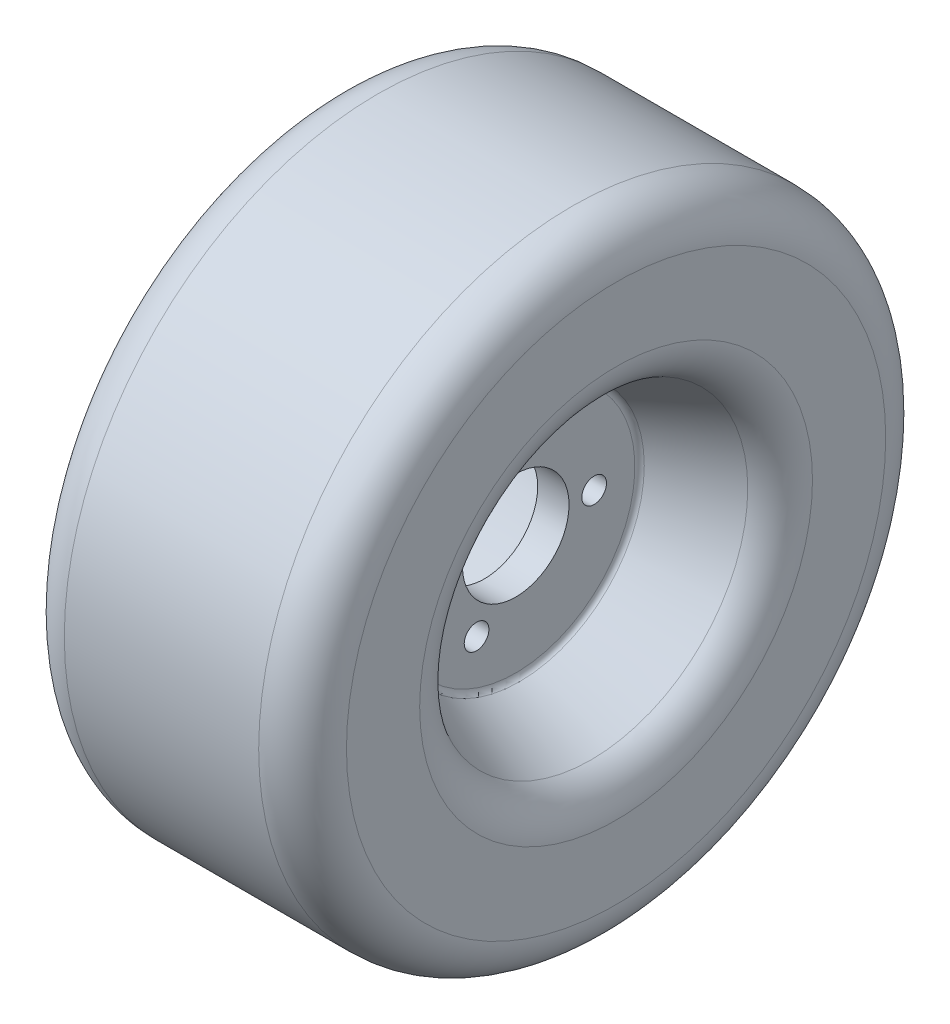
ISO-10303-21;
HEADER;
FILE_DESCRIPTION(('STEP AP214'),'2;1');
FILE_NAME('part.step','',(''),(''),'','','');
FILE_SCHEMA(('AUTOMOTIVE_DESIGN { 1 0 10303 214 1 1 1 1 }'));
ENDSEC;
DATA;
#1=APPLICATION_CONTEXT('core data for automotive mechanical design processes');
#2=APPLICATION_PROTOCOL_DEFINITION('international standard','automotive_design',2000,#1);
#3=PRODUCT_CONTEXT('',#1,'mechanical');
#4=PRODUCT('Part','Part','',(#3));
#5=PRODUCT_RELATED_PRODUCT_CATEGORY('part','',(#4));
#6=PRODUCT_DEFINITION_FORMATION('','',#4);
#7=PRODUCT_DEFINITION_CONTEXT('part definition',#1,'design');
#8=PRODUCT_DEFINITION('design','',#6,#7);
#9=PRODUCT_DEFINITION_SHAPE('','',#8);
#10=(LENGTH_UNIT() NAMED_UNIT(*) SI_UNIT(.MILLI.,.METRE.));
#11=(NAMED_UNIT(*) PLANE_ANGLE_UNIT() SI_UNIT($,.RADIAN.));
#12=(NAMED_UNIT(*) SI_UNIT($,.STERADIAN.) SOLID_ANGLE_UNIT());
#13=UNCERTAINTY_MEASURE_WITH_UNIT(LENGTH_MEASURE(1.E-05),#10,'distance_accuracy_value','');
#14=(GEOMETRIC_REPRESENTATION_CONTEXT(3) GLOBAL_UNCERTAINTY_ASSIGNED_CONTEXT((#13)) GLOBAL_UNIT_ASSIGNED_CONTEXT((#10,
#11,#12)) REPRESENTATION_CONTEXT('',''));
#15=CARTESIAN_POINT('',(0.,0.,0.));
#16=DIRECTION('',(0.,0.,1.));
#17=DIRECTION('',(1.,0.,0.));
#18=AXIS2_PLACEMENT_3D('',#15,#16,#17);
#19=CARTESIAN_POINT('',(16.51,0.,0.));
#20=DIRECTION('',(-1.,0.,0.));
#21=DIRECTION('',(0.,0.,1.));
#22=AXIS2_PLACEMENT_3D('',#19,#20,#21);
#23=PLANE('',#22);
#24=CARTESIAN_POINT('',(16.51,0.,0.));
#25=DIRECTION('',(-1.,0.,0.));
#26=DIRECTION('',(0.,0.,1.));
#27=AXIS2_PLACEMENT_3D('',#24,#25,#26);
#28=CIRCLE('',#27,48.2441001243799);
#29=CARTESIAN_POINT('',(16.51,0.,48.2441001243799));
#30=VERTEX_POINT('',#29);
#31=EDGE_CURVE('E43',#30,#30,#28,.F.);
#32=ORIENTED_EDGE('',*,*,#31,.T.);
#33=EDGE_LOOP('',(#32));
#34=FACE_BOUND('',#33,.T.);
#35=CARTESIAN_POINT('',(16.51,0.,-31.75));
#36=DIRECTION('',(-1.,0.,0.));
#37=DIRECTION('',(0.,0.,1.));
#38=AXIS2_PLACEMENT_3D('',#35,#36,#37);
#39=CIRCLE('',#38,5.);
#40=CARTESIAN_POINT('',(16.51,0.,-26.75));
#41=VERTEX_POINT('',#40);
#42=EDGE_CURVE('E56',#41,#41,#39,.T.);
#43=ORIENTED_EDGE('',*,*,#42,.T.);
#44=EDGE_LOOP('',(#43));
#45=FACE_BOUND('',#44,.T.);
#46=CARTESIAN_POINT('',(16.51,-27.4963065701559,15.8750000000001));
#47=DIRECTION('',(-1.,0.,0.));
#48=DIRECTION('',(0.,0.,1.));
#49=AXIS2_PLACEMENT_3D('',#46,#47,#48);
#50=CIRCLE('',#49,5.);
#51=CARTESIAN_POINT('',(16.51,-27.4963065701559,20.8750000000001));
#52=VERTEX_POINT('',#51);
#53=EDGE_CURVE('E57',#52,#52,#50,.T.);
#54=ORIENTED_EDGE('',*,*,#53,.T.);
#55=EDGE_LOOP('',(#54));
#56=FACE_BOUND('',#55,.T.);
#57=CARTESIAN_POINT('',(16.51,27.4963065701561,15.8749999999997));
#58=DIRECTION('',(-1.,0.,0.));
#59=DIRECTION('',(0.,0.,1.));
#60=AXIS2_PLACEMENT_3D('',#57,#58,#59);
#61=CIRCLE('',#60,5.);
#62=CARTESIAN_POINT('',(16.51,27.4963065701561,20.8749999999997));
#63=VERTEX_POINT('',#62);
#64=EDGE_CURVE('E61',#63,#63,#61,.T.);
#65=ORIENTED_EDGE('',*,*,#64,.T.);
#66=EDGE_LOOP('',(#65));
#67=FACE_BOUND('',#66,.T.);
#68=CARTESIAN_POINT('',(16.51,0.,0.));
#69=DIRECTION('',(-1.,0.,0.));
#70=DIRECTION('',(0.,0.,1.));
#71=AXIS2_PLACEMENT_3D('',#68,#69,#70);
#72=CIRCLE('',#71,21.59);
#73=CARTESIAN_POINT('',(16.51,0.,21.59));
#74=VERTEX_POINT('',#73);
#75=EDGE_CURVE('E68',#74,#74,#72,.T.);
#76=ORIENTED_EDGE('',*,*,#75,.T.);
#77=EDGE_LOOP('',(#76));
#78=FACE_BOUND('',#77,.T.);
#79=ADVANCED_FACE('F32',(#34,#45,#56,#67,#78),#23,.F.);
#80=CARTESIAN_POINT('',(16.51,0.,0.));
#81=DIRECTION('',(1.,0.,0.));
#82=DIRECTION('',(0.,0.,-1.));
#83=AXIS2_PLACEMENT_3D('',#80,#81,#82);
#84=CONICAL_SURFACE('',#83,49.8917332317404,0.419910702861543);
#85=CARTESIAN_POINT('',(18.0144955553808,0.,0.));
#86=DIRECTION('',(1.,0.,0.));
#87=DIRECTION('',(0.,0.,-1.));
#88=AXIS2_PLACEMENT_3D('',#85,#86,#87);
#89=CIRCLE('',#88,50.563438509604);
#90=CARTESIAN_POINT('',(18.0144955553808,0.,-50.563438509604));
#91=VERTEX_POINT('',#90);
#92=EDGE_CURVE('E47',#91,#91,#89,.F.);
#93=ORIENTED_EDGE('',*,*,#92,.T.);
#94=EDGE_LOOP('',(#93));
#95=FACE_BOUND('',#94,.T.);
#96=CARTESIAN_POINT('',(46.99,0.,0.));
#97=DIRECTION('',(-1.,0.,0.));
#98=DIRECTION('',(0.,0.,1.));
#99=AXIS2_PLACEMENT_3D('',#96,#97,#98);
#100=CIRCLE('',#99,63.5);
#101=CARTESIAN_POINT('',(46.99,0.,63.5));
#102=VERTEX_POINT('',#101);
#103=EDGE_CURVE('E52',#102,#102,#100,.T.);
#104=ORIENTED_EDGE('',*,*,#103,.F.);
#105=EDGE_LOOP('',(#104));
#106=FACE_BOUND('',#105,.T.);
#107=ADVANCED_FACE('F121',(#95,#106),#84,.F.);
#108=CARTESIAN_POINT('',(39.37,0.,0.));
#109=DIRECTION('',(-1.,0.,0.));
#110=DIRECTION('',(0.,0.,1.));
#111=AXIS2_PLACEMENT_3D('',#108,#109,#110);
#112=TOROIDAL_SURFACE('',#111,79.5643705136554,17.78);
#113=CARTESIAN_POINT('',(57.15,0.,0.));
#114=DIRECTION('',(-1.,0.,0.));
#115=DIRECTION('',(0.,0.,1.));
#116=AXIS2_PLACEMENT_3D('',#113,#114,#115);
#117=CIRCLE('',#116,79.5643705136554);
#118=CARTESIAN_POINT('',(57.15,0.,79.5643705136554));
#119=VERTEX_POINT('',#118);
#120=EDGE_CURVE('E71',#119,#119,#117,.T.);
#121=ORIENTED_EDGE('',*,*,#120,.F.);
#122=EDGE_LOOP('',(#121));
#123=FACE_BOUND('',#122,.T.);
#124=ORIENTED_EDGE('',*,*,#103,.T.);
#125=EDGE_LOOP('',(#124));
#126=FACE_BOUND('',#125,.T.);
#127=ADVANCED_FACE('F127',(#123,#126),#112,.T.);
#128=CARTESIAN_POINT('',(57.15,109.22,0.));
#129=DIRECTION('',(-1.,0.,0.));
#130=DIRECTION('',(0.,0.,1.));
#131=AXIS2_PLACEMENT_3D('',#128,#129,#130);
#132=PLANE('',#131);
#133=CARTESIAN_POINT('',(57.15,0.,0.));
#134=DIRECTION('',(-1.,0.,0.));
#135=DIRECTION('',(0.,0.,1.));
#136=AXIS2_PLACEMENT_3D('',#133,#134,#135);
#137=CIRCLE('',#136,109.22);
#138=CARTESIAN_POINT('',(57.15,0.,109.22));
#139=VERTEX_POINT('',#138);
#140=EDGE_CURVE('E74',#139,#139,#137,.T.);
#141=ORIENTED_EDGE('',*,*,#140,.F.);
#142=EDGE_LOOP('',(#141));
#143=FACE_BOUND('',#142,.T.);
#144=ORIENTED_EDGE('',*,*,#120,.T.);
#145=EDGE_LOOP('',(#144));
#146=FACE_BOUND('',#145,.T.);
#147=ADVANCED_FACE('F149',(#143,#146),#132,.F.);
#148=CARTESIAN_POINT('',(39.37,0.,0.));
#149=DIRECTION('',(-1.,0.,0.));
#150=DIRECTION('',(0.,0.,1.));
#151=AXIS2_PLACEMENT_3D('',#148,#149,#150);
#152=TOROIDAL_SURFACE('',#151,109.22,17.78);
#153=CARTESIAN_POINT('',(39.37,0.,0.));
#154=DIRECTION('',(-1.,0.,0.));
#155=DIRECTION('',(0.,0.,1.));
#156=AXIS2_PLACEMENT_3D('',#153,#154,#155);
#157=CIRCLE('',#156,127.);
#158=CARTESIAN_POINT('',(39.37,0.,127.));
#159=VERTEX_POINT('',#158);
#160=EDGE_CURVE('E77',#159,#159,#157,.T.);
#161=ORIENTED_EDGE('',*,*,#160,.F.);
#162=EDGE_LOOP('',(#161));
#163=FACE_BOUND('',#162,.T.);
#164=ORIENTED_EDGE('',*,*,#140,.T.);
#165=EDGE_LOOP('',(#164));
#166=FACE_BOUND('',#165,.T.);
#167=ADVANCED_FACE('F154',(#163,#166),#152,.T.);
#168=CARTESIAN_POINT('',(3.79674298209649,0.,0.));
#169=DIRECTION('',(-1.,0.,0.));
#170=DIRECTION('',(0.,0.,1.));
#171=AXIS2_PLACEMENT_3D('',#168,#169,#170);
#172=CYLINDRICAL_SURFACE('',#171,127.);
#173=CARTESIAN_POINT('',(-39.37,0.,0.));
#174=DIRECTION('',(-1.,0.,0.));
#175=DIRECTION('',(0.,0.,1.));
#176=AXIS2_PLACEMENT_3D('',#173,#174,#175);
#177=CIRCLE('',#176,127.);
#178=CARTESIAN_POINT('',(-39.37,0.,127.));
#179=VERTEX_POINT('',#178);
#180=EDGE_CURVE('E80',#179,#179,#177,.T.);
#181=ORIENTED_EDGE('',*,*,#180,.F.);
#182=EDGE_LOOP('',(#181));
#183=FACE_BOUND('',#182,.T.);
#184=ORIENTED_EDGE('',*,*,#160,.T.);
#185=EDGE_LOOP('',(#184));
#186=FACE_BOUND('',#185,.T.);
#187=ADVANCED_FACE('F161',(#183,#186),#172,.T.);
#188=CARTESIAN_POINT('',(-39.37,0.,0.));
#189=DIRECTION('',(-1.,0.,0.));
#190=DIRECTION('',(0.,0.,1.));
#191=AXIS2_PLACEMENT_3D('',#188,#189,#190);
#192=TOROIDAL_SURFACE('',#191,109.22,17.78);
#193=CARTESIAN_POINT('',(-57.15,0.,0.));
#194=DIRECTION('',(-1.,0.,0.));
#195=DIRECTION('',(0.,0.,1.));
#196=AXIS2_PLACEMENT_3D('',#193,#194,#195);
#197=CIRCLE('',#196,109.22);
#198=CARTESIAN_POINT('',(-57.15,0.,109.22));
#199=VERTEX_POINT('',#198);
#200=EDGE_CURVE('E83',#199,#199,#197,.T.);
#201=ORIENTED_EDGE('',*,*,#200,.F.);
#202=EDGE_LOOP('',(#201));
#203=FACE_BOUND('',#202,.T.);
#204=ORIENTED_EDGE('',*,*,#180,.T.);
#205=EDGE_LOOP('',(#204));
#206=FACE_BOUND('',#205,.T.);
#207=ADVANCED_FACE('F165',(#203,#206),#192,.T.);
#208=CARTESIAN_POINT('',(-57.15,109.22,0.));
#209=DIRECTION('',(1.,0.,0.));
#210=DIRECTION('',(0.,0.,-1.));
#211=AXIS2_PLACEMENT_3D('',#208,#209,#210);
#212=PLANE('',#211);
#213=CARTESIAN_POINT('',(-57.15,0.,0.));
#214=DIRECTION('',(-1.,0.,0.));
#215=DIRECTION('',(0.,0.,1.));
#216=AXIS2_PLACEMENT_3D('',#213,#214,#215);
#217=CIRCLE('',#216,79.5643705136554);
#218=CARTESIAN_POINT('',(-57.15,0.,79.5643705136554));
#219=VERTEX_POINT('',#218);
#220=EDGE_CURVE('E86',#219,#219,#217,.T.);
#221=ORIENTED_EDGE('',*,*,#220,.F.);
#222=EDGE_LOOP('',(#221));
#223=FACE_BOUND('',#222,.T.);
#224=ORIENTED_EDGE('',*,*,#200,.T.);
#225=EDGE_LOOP('',(#224));
#226=FACE_BOUND('',#225,.T.);
#227=ADVANCED_FACE('F169',(#223,#226),#212,.F.);
#228=CARTESIAN_POINT('',(-39.37,0.,0.));
#229=DIRECTION('',(-1.,0.,0.));
#230=DIRECTION('',(0.,0.,1.));
#231=AXIS2_PLACEMENT_3D('',#228,#229,#230);
#232=TOROIDAL_SURFACE('',#231,79.5643705136554,17.78);
#233=CARTESIAN_POINT('',(-46.99,0.,0.));
#234=DIRECTION('',(-1.,0.,0.));
#235=DIRECTION('',(0.,0.,1.));
#236=AXIS2_PLACEMENT_3D('',#233,#234,#235);
#237=CIRCLE('',#236,63.5);
#238=CARTESIAN_POINT('',(-46.99,0.,63.5));
#239=VERTEX_POINT('',#238);
#240=EDGE_CURVE('E89',#239,#239,#237,.T.);
#241=ORIENTED_EDGE('',*,*,#240,.F.);
#242=EDGE_LOOP('',(#241));
#243=FACE_BOUND('',#242,.T.);
#244=ORIENTED_EDGE('',*,*,#220,.T.);
#245=EDGE_LOOP('',(#244));
#246=FACE_BOUND('',#245,.T.);
#247=ADVANCED_FACE('F173',(#243,#246),#232,.T.);
#248=CARTESIAN_POINT('',(-46.99,0.,0.));
#249=DIRECTION('',(-1.,0.,0.));
#250=DIRECTION('',(0.,0.,1.));
#251=AXIS2_PLACEMENT_3D('',#248,#249,#250);
#252=CONICAL_SURFACE('',#251,63.5,0.261799387799146);
#253=CARTESIAN_POINT('',(1.91414335665689,0.,0.));
#254=DIRECTION('',(-1.,0.,0.));
#255=DIRECTION('',(0.,0.,1.));
#256=AXIS2_PLACEMENT_3D('',#253,#254,#255);
#257=CIRCLE('',#256,50.3961742810481);
#258=CARTESIAN_POINT('',(1.91414335665689,0.,50.3961742810481));
#259=VERTEX_POINT('',#258);
#260=EDGE_CURVE('E10',#259,#259,#257,.F.);
#261=ORIENTED_EDGE('',*,*,#260,.T.);
#262=EDGE_LOOP('',(#261));
#263=FACE_BOUND('',#262,.T.);
#264=ORIENTED_EDGE('',*,*,#240,.T.);
#265=EDGE_LOOP('',(#264));
#266=FACE_BOUND('',#265,.T.);
#267=ADVANCED_FACE('F177',(#263,#266),#252,.F.);
#268=CARTESIAN_POINT('',(3.79674298209649,49.8917332317404,0.));
#269=DIRECTION('',(1.,0.,0.));
#270=DIRECTION('',(0.,0.,-1.));
#271=AXIS2_PLACEMENT_3D('',#268,#269,#270);
#272=PLANE('',#271);
#273=CARTESIAN_POINT('',(3.79674298209649,0.,0.));
#274=DIRECTION('',(1.,0.,0.));
#275=DIRECTION('',(0.,0.,-1.));
#276=AXIS2_PLACEMENT_3D('',#273,#274,#275);
#277=CIRCLE('',#276,47.9427226822739);
#278=CARTESIAN_POINT('',(3.79674298209649,0.,-47.9427226822739));
#279=VERTEX_POINT('',#278);
#280=EDGE_CURVE('E39',#279,#279,#277,.F.);
#281=ORIENTED_EDGE('',*,*,#280,.T.);
#282=EDGE_LOOP('',(#281));
#283=FACE_BOUND('',#282,.T.);
#284=CARTESIAN_POINT('',(3.79674298209649,0.,-31.75));
#285=DIRECTION('',(1.,0.,0.));
#286=DIRECTION('',(0.,0.,-1.));
#287=AXIS2_PLACEMENT_3D('',#284,#285,#286);
#288=CIRCLE('',#287,5.);
#289=CARTESIAN_POINT('',(3.79674298209649,0.,-36.75));
#290=VERTEX_POINT('',#289);
#291=EDGE_CURVE('E53',#290,#290,#288,.T.);
#292=ORIENTED_EDGE('',*,*,#291,.T.);
#293=EDGE_LOOP('',(#292));
#294=FACE_BOUND('',#293,.T.);
#295=CARTESIAN_POINT('',(3.79674298209649,-27.4963065701559,15.8750000000001));
#296=DIRECTION('',(1.,0.,0.));
#297=DIRECTION('',(0.,0.,-1.));
#298=AXIS2_PLACEMENT_3D('',#295,#296,#297);
#299=CIRCLE('',#298,5.);
#300=CARTESIAN_POINT('',(3.79674298209649,-27.4963065701559,10.8750000000001));
#301=VERTEX_POINT('',#300);
#302=EDGE_CURVE('E58',#301,#301,#299,.T.);
#303=ORIENTED_EDGE('',*,*,#302,.T.);
#304=EDGE_LOOP('',(#303));
#305=FACE_BOUND('',#304,.T.);
#306=CARTESIAN_POINT('',(3.79674298209649,27.4963065701561,15.8749999999997));
#307=DIRECTION('',(1.,0.,0.));
#308=DIRECTION('',(0.,0.,-1.));
#309=AXIS2_PLACEMENT_3D('',#306,#307,#308);
#310=CIRCLE('',#309,5.);
#311=CARTESIAN_POINT('',(3.79674298209649,27.4963065701561,10.8749999999997));
#312=VERTEX_POINT('',#311);
#313=EDGE_CURVE('E62',#312,#312,#310,.T.);
#314=ORIENTED_EDGE('',*,*,#313,.T.);
#315=EDGE_LOOP('',(#314));
#316=FACE_BOUND('',#315,.T.);
#317=CARTESIAN_POINT('',(3.79674298209649,0.,0.));
#318=DIRECTION('',(1.,0.,0.));
#319=DIRECTION('',(0.,0.,-1.));
#320=AXIS2_PLACEMENT_3D('',#317,#318,#319);
#321=CIRCLE('',#320,21.59);
#322=CARTESIAN_POINT('',(3.79674298209649,0.,-21.59));
#323=VERTEX_POINT('',#322);
#324=EDGE_CURVE('E65',#323,#323,#321,.T.);
#325=ORIENTED_EDGE('',*,*,#324,.T.);
#326=EDGE_LOOP('',(#325));
#327=FACE_BOUND('',#326,.T.);
#328=ADVANCED_FACE('F116',(#283,#294,#305,#316,#327),#272,.F.);
#329=CARTESIAN_POINT('',(-57.15,0.,0.));
#330=DIRECTION('',(1.,0.,0.));
#331=DIRECTION('',(0.,0.,-1.));
#332=AXIS2_PLACEMENT_3D('',#329,#330,#331);
#333=CYLINDRICAL_SURFACE('',#332,21.59);
#334=ORIENTED_EDGE('',*,*,#324,.F.);
#335=EDGE_LOOP('',(#334));
#336=FACE_BOUND('',#335,.T.);
#337=ORIENTED_EDGE('',*,*,#75,.F.);
#338=EDGE_LOOP('',(#337));
#339=FACE_BOUND('',#338,.T.);
#340=ADVANCED_FACE('F106',(#336,#339),#333,.F.);
#341=CARTESIAN_POINT('',(-57.15,27.4963065701561,15.8749999999997));
#342=DIRECTION('',(1.,0.,0.));
#343=DIRECTION('',(0.,0.,-1.));
#344=AXIS2_PLACEMENT_3D('',#341,#342,#343);
#345=CYLINDRICAL_SURFACE('',#344,5.);
#346=ORIENTED_EDGE('',*,*,#313,.F.);
#347=EDGE_LOOP('',(#346));
#348=FACE_BOUND('',#347,.T.);
#349=ORIENTED_EDGE('',*,*,#64,.F.);
#350=EDGE_LOOP('',(#349));
#351=FACE_BOUND('',#350,.T.);
#352=ADVANCED_FACE('F103',(#348,#351),#345,.F.);
#353=CARTESIAN_POINT('',(-57.15,-27.4963065701559,15.8750000000001));
#354=DIRECTION('',(1.,0.,0.));
#355=DIRECTION('',(0.,0.,-1.));
#356=AXIS2_PLACEMENT_3D('',#353,#354,#355);
#357=CYLINDRICAL_SURFACE('',#356,5.);
#358=ORIENTED_EDGE('',*,*,#302,.F.);
#359=EDGE_LOOP('',(#358));
#360=FACE_BOUND('',#359,.T.);
#361=ORIENTED_EDGE('',*,*,#53,.F.);
#362=EDGE_LOOP('',(#361));
#363=FACE_BOUND('',#362,.T.);
#364=ADVANCED_FACE('F105',(#360,#363),#357,.F.);
#365=CARTESIAN_POINT('',(-57.15,0.,-31.75));
#366=DIRECTION('',(1.,0.,0.));
#367=DIRECTION('',(0.,0.,-1.));
#368=AXIS2_PLACEMENT_3D('',#365,#366,#367);
#369=CYLINDRICAL_SURFACE('',#368,5.);
#370=ORIENTED_EDGE('',*,*,#291,.F.);
#371=EDGE_LOOP('',(#370));
#372=FACE_BOUND('',#371,.T.);
#373=ORIENTED_EDGE('',*,*,#42,.F.);
#374=EDGE_LOOP('',(#373));
#375=FACE_BOUND('',#374,.T.);
#376=ADVANCED_FACE('F113',(#372,#375),#369,.F.);
#377=CARTESIAN_POINT('',(19.05,0.,0.));
#378=DIRECTION('',(-1.,0.,0.));
#379=DIRECTION('',(0.,0.,1.));
#380=AXIS2_PLACEMENT_3D('',#377,#378,#379);
#381=TOROIDAL_SURFACE('',#380,48.2441001243799,2.54);
#382=ORIENTED_EDGE('',*,*,#31,.F.);
#383=EDGE_LOOP('',(#382));
#384=FACE_BOUND('',#383,.T.);
#385=ORIENTED_EDGE('',*,*,#92,.F.);
#386=EDGE_LOOP('',(#385));
#387=FACE_BOUND('',#386,.T.);
#388=ADVANCED_FACE('F132',(#384,#387),#381,.F.);
#389=CARTESIAN_POINT('',(1.25674298209649,0.,0.));
#390=DIRECTION('',(1.,0.,0.));
#391=DIRECTION('',(0.,0.,-1.));
#392=AXIS2_PLACEMENT_3D('',#389,#390,#391);
#393=TOROIDAL_SURFACE('',#392,47.9427226822739,2.54);
#394=ORIENTED_EDGE('',*,*,#260,.F.);
#395=EDGE_LOOP('',(#394));
#396=FACE_BOUND('',#395,.T.);
#397=ORIENTED_EDGE('',*,*,#280,.F.);
#398=EDGE_LOOP('',(#397));
#399=FACE_BOUND('',#398,.T.);
#400=ADVANCED_FACE('F34',(#396,#399),#393,.F.);
#401=CLOSED_SHELL('',(#79,#107,#127,#147,#167,#187,#207,#227,#247,#267,#328,#340,#352,#364,#376,
#388,#400));
#402=MANIFOLD_SOLID_BREP('B2',#401);
#403=ADVANCED_BREP_SHAPE_REPRESENTATION('',(#18,#402),#14);
#404=SHAPE_DEFINITION_REPRESENTATION(#9,#403);
ENDSEC;
END-ISO-10303-21;
